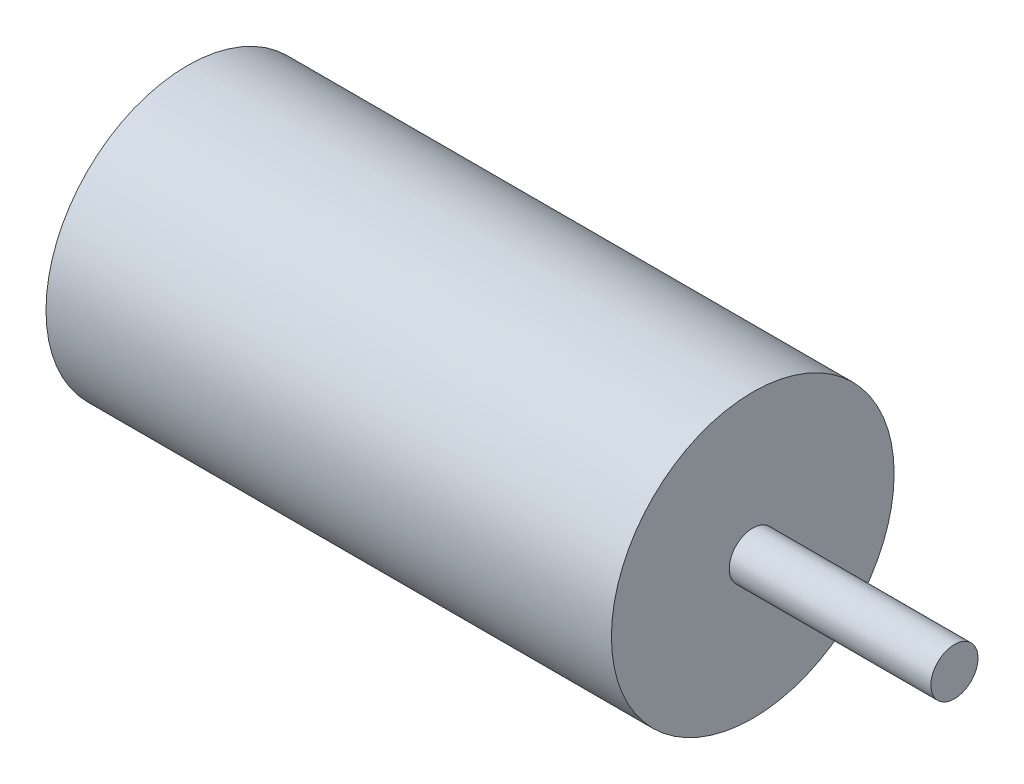
ISO-10303-21;
HEADER;
FILE_DESCRIPTION(('STEP AP214'),'2;1');
FILE_NAME('part.step','',(''),(''),'','','');
FILE_SCHEMA(('AUTOMOTIVE_DESIGN { 1 0 10303 214 1 1 1 1 }'));
ENDSEC;
DATA;
#1=APPLICATION_CONTEXT('core data for automotive mechanical design processes');
#2=APPLICATION_PROTOCOL_DEFINITION('international standard','automotive_design',2000,#1);
#3=PRODUCT_CONTEXT('',#1,'mechanical');
#4=PRODUCT('Part','Part','',(#3));
#5=PRODUCT_RELATED_PRODUCT_CATEGORY('part','',(#4));
#6=PRODUCT_DEFINITION_FORMATION('','',#4);
#7=PRODUCT_DEFINITION_CONTEXT('part definition',#1,'design');
#8=PRODUCT_DEFINITION('design','',#6,#7);
#9=PRODUCT_DEFINITION_SHAPE('','',#8);
#10=(LENGTH_UNIT() NAMED_UNIT(*) SI_UNIT(.MILLI.,.METRE.));
#11=(NAMED_UNIT(*) PLANE_ANGLE_UNIT() SI_UNIT($,.RADIAN.));
#12=(NAMED_UNIT(*) SI_UNIT($,.STERADIAN.) SOLID_ANGLE_UNIT());
#13=UNCERTAINTY_MEASURE_WITH_UNIT(LENGTH_MEASURE(1.E-05),#10,'distance_accuracy_value','');
#14=(GEOMETRIC_REPRESENTATION_CONTEXT(3) GLOBAL_UNCERTAINTY_ASSIGNED_CONTEXT((#13)) GLOBAL_UNIT_ASSIGNED_CONTEXT((#10,
#11,#12)) REPRESENTATION_CONTEXT('',''));
#15=CARTESIAN_POINT('',(0.,0.,0.));
#16=DIRECTION('',(0.,0.,1.));
#17=DIRECTION('',(1.,0.,0.));
#18=AXIS2_PLACEMENT_3D('',#15,#16,#17);
#19=CARTESIAN_POINT('',(76.2,0.,0.));
#20=DIRECTION('',(-1.,0.,0.));
#21=DIRECTION('',(0.,0.,1.));
#22=AXIS2_PLACEMENT_3D('',#19,#20,#21);
#23=CYLINDRICAL_SURFACE('',#22,19.05);
#24=CARTESIAN_POINT('',(76.2,0.,0.));
#25=DIRECTION('',(1.,0.,0.));
#26=DIRECTION('',(0.,0.,-1.));
#27=AXIS2_PLACEMENT_3D('',#24,#25,#26);
#28=CIRCLE('',#27,19.05);
#29=CARTESIAN_POINT('',(76.2,0.,19.05));
#30=VERTEX_POINT('',#29);
#31=EDGE_CURVE('E10',#30,#30,#28,.T.);
#32=CARTESIAN_POINT('',(0.,0.,0.));
#33=DIRECTION('',(1.,0.,0.));
#34=DIRECTION('',(0.,0.,-1.));
#35=AXIS2_PLACEMENT_3D('',#32,#33,#34);
#36=CIRCLE('',#35,19.05);
#37=CARTESIAN_POINT('',(0.,0.,19.05));
#38=VERTEX_POINT('',#37);
#39=EDGE_CURVE('E34',#38,#38,#36,.T.);
#40=CARTESIAN_POINT('',(76.2,0.,19.05));
#41=CARTESIAN_POINT('',(75.40625,0.,19.05));
#42=CARTESIAN_POINT('',(74.6125,0.,19.05));
#43=CARTESIAN_POINT('',(73.025,0.,19.05));
#44=CARTESIAN_POINT('',(72.23125,0.,19.05));
#45=CARTESIAN_POINT('',(70.64375,0.,19.05));
#46=CARTESIAN_POINT('',(69.85,0.,19.05));
#47=CARTESIAN_POINT('',(68.2625,0.,19.05));
#48=CARTESIAN_POINT('',(67.46875,0.,19.05));
#49=CARTESIAN_POINT('',(65.88125,0.,19.05));
#50=CARTESIAN_POINT('',(65.0875,0.,19.05));
#51=CARTESIAN_POINT('',(63.5,0.,19.05));
#52=CARTESIAN_POINT('',(62.70625,0.,19.05));
#53=CARTESIAN_POINT('',(61.11875,0.,19.05));
#54=CARTESIAN_POINT('',(60.325,0.,19.05));
#55=CARTESIAN_POINT('',(58.7375,0.,19.05));
#56=CARTESIAN_POINT('',(57.94375,0.,19.05));
#57=CARTESIAN_POINT('',(56.35625,0.,19.05));
#58=CARTESIAN_POINT('',(55.5625,0.,19.05));
#59=CARTESIAN_POINT('',(53.975,0.,19.05));
#60=CARTESIAN_POINT('',(53.18125,0.,19.05));
#61=CARTESIAN_POINT('',(51.59375,0.,19.05));
#62=CARTESIAN_POINT('',(50.8,0.,19.05));
#63=CARTESIAN_POINT('',(49.2125,0.,19.05));
#64=CARTESIAN_POINT('',(48.41875,0.,19.05));
#65=CARTESIAN_POINT('',(46.83125,0.,19.05));
#66=CARTESIAN_POINT('',(46.0375,0.,19.05));
#67=CARTESIAN_POINT('',(44.45,0.,19.05));
#68=CARTESIAN_POINT('',(43.65625,0.,19.05));
#69=CARTESIAN_POINT('',(42.06875,0.,19.05));
#70=CARTESIAN_POINT('',(41.275,0.,19.05));
#71=CARTESIAN_POINT('',(39.6875,0.,19.05));
#72=CARTESIAN_POINT('',(38.89375,0.,19.05));
#73=CARTESIAN_POINT('',(37.30625,0.,19.05));
#74=CARTESIAN_POINT('',(36.5125,0.,19.05));
#75=CARTESIAN_POINT('',(34.925,0.,19.05));
#76=CARTESIAN_POINT('',(34.13125,0.,19.05));
#77=CARTESIAN_POINT('',(32.54375,0.,19.05));
#78=CARTESIAN_POINT('',(31.75,0.,19.05));
#79=CARTESIAN_POINT('',(30.1625,0.,19.05));
#80=CARTESIAN_POINT('',(29.36875,0.,19.05));
#81=CARTESIAN_POINT('',(27.78125,0.,19.05));
#82=CARTESIAN_POINT('',(26.9875,0.,19.05));
#83=CARTESIAN_POINT('',(25.4,0.,19.05));
#84=CARTESIAN_POINT('',(24.60625,0.,19.05));
#85=CARTESIAN_POINT('',(23.01875,0.,19.05));
#86=CARTESIAN_POINT('',(22.225,0.,19.05));
#87=CARTESIAN_POINT('',(20.6375,0.,19.05));
#88=CARTESIAN_POINT('',(19.84375,0.,19.05));
#89=CARTESIAN_POINT('',(18.25625,0.,19.05));
#90=CARTESIAN_POINT('',(17.4625,0.,19.05));
#91=CARTESIAN_POINT('',(15.875,0.,19.05));
#92=CARTESIAN_POINT('',(15.08125,0.,19.05));
#93=CARTESIAN_POINT('',(13.49375,0.,19.05));
#94=CARTESIAN_POINT('',(12.7,0.,19.05));
#95=CARTESIAN_POINT('',(11.1125,0.,19.05));
#96=CARTESIAN_POINT('',(10.31875,0.,19.05));
#97=CARTESIAN_POINT('',(8.73125,0.,19.05));
#98=CARTESIAN_POINT('',(7.93750000000001,0.,19.05));
#99=CARTESIAN_POINT('',(6.35,0.,19.05));
#100=CARTESIAN_POINT('',(5.55625,0.,19.05));
#101=CARTESIAN_POINT('',(3.96875,0.,19.05));
#102=CARTESIAN_POINT('',(3.175,0.,19.05));
#103=CARTESIAN_POINT('',(1.5875,0.,19.05));
#104=CARTESIAN_POINT('',(0.793750000000001,0.,19.05));
#105=CARTESIAN_POINT('',(0.,0.,19.05));
#106=B_SPLINE_CURVE_WITH_KNOTS('',3,(#40,#41,#42,#43,#44,#45,#46,#47,#48,#49,#50,#51,#52,#53,
#54,#55,#56,#57,#58,#59,#60,#61,#62,#63,#64,#65,#66,#67,#68,#69,#70,#71,#72,#73,#74,#75,#76,#77,
#78,#79,#80,#81,#82,#83,#84,#85,#86,#87,#88,#89,#90,#91,#92,#93,#94,#95,#96,#97,#98,#99,#100,
#101,#102,#103,#104,#105),.UNSPECIFIED.,.F.,.F.,(4,2,2,2,2,2,2,2,2,2,2,2,2,2,2,2,2,2,2,2,2,2,2,
2,2,2,2,2,2,2,2,2,4),(0.,2.38125,4.7625,7.14375,9.52500000000001,11.90625,14.2875,16.66875,
19.05,21.43125,23.8125,26.19375,28.575,30.95625,33.3375,35.71875,38.1,40.48125,42.8625,45.24375,
47.625,50.00625,52.3875,54.76875,57.15,59.53125,61.9125,64.29375,66.675,69.05625,71.4375,
73.81875,76.2),.UNSPECIFIED.);
#107=EDGE_CURVE('BSEAM31',#30,#38,#106,.T.);
#108=ORIENTED_EDGE('',*,*,#31,.F.);
#109=ORIENTED_EDGE('',*,*,#39,.T.);
#110=ORIENTED_EDGE('',*,*,#107,.T.);
#111=ORIENTED_EDGE('',*,*,#107,.F.);
#112=EDGE_LOOP('',(#108,#110,#109,#111));
#113=FACE_BOUND('',#112,.T.);
#114=ADVANCED_FACE('F31',(#113),#23,.T.);
#115=CARTESIAN_POINT('',(76.2,0.,0.));
#116=DIRECTION('',(1.,0.,0.));
#117=DIRECTION('',(0.,0.,-1.));
#118=AXIS2_PLACEMENT_3D('',#115,#116,#117);
#119=PLANE('',#118);
#120=CARTESIAN_POINT('',(76.2,0.,0.));
#121=DIRECTION('',(1.,0.,0.));
#122=DIRECTION('',(0.,0.,-1.));
#123=AXIS2_PLACEMENT_3D('',#120,#121,#122);
#124=CIRCLE('',#123,3.175);
#125=CARTESIAN_POINT('',(76.2,0.,-3.175));
#126=VERTEX_POINT('',#125);
#127=EDGE_CURVE('E43',#126,#126,#124,.T.);
#128=ORIENTED_EDGE('',*,*,#127,.F.);
#129=EDGE_LOOP('',(#128));
#130=FACE_BOUND('',#129,.T.);
#131=ORIENTED_EDGE('',*,*,#31,.T.);
#132=EDGE_LOOP('',(#131));
#133=FACE_BOUND('',#132,.T.);
#134=ADVANCED_FACE('F58',(#130,#133),#119,.T.);
#135=CARTESIAN_POINT('',(0.,0.,0.));
#136=DIRECTION('',(1.,0.,0.));
#137=DIRECTION('',(0.,0.,-1.));
#138=AXIS2_PLACEMENT_3D('',#135,#136,#137);
#139=PLANE('',#138);
#140=ORIENTED_EDGE('',*,*,#39,.F.);
#141=EDGE_LOOP('',(#140));
#142=FACE_BOUND('',#141,.T.);
#143=ADVANCED_FACE('F54',(#142),#139,.F.);
#144=CARTESIAN_POINT('',(103.378,0.,0.));
#145=DIRECTION('',(-1.,0.,0.));
#146=DIRECTION('',(0.,0.,1.));
#147=AXIS2_PLACEMENT_3D('',#144,#145,#146);
#148=CYLINDRICAL_SURFACE('',#147,3.175);
#149=CARTESIAN_POINT('',(103.378,0.,0.));
#150=DIRECTION('',(1.,0.,0.));
#151=DIRECTION('',(0.,0.,-1.));
#152=AXIS2_PLACEMENT_3D('',#149,#150,#151);
#153=CIRCLE('',#152,3.175);
#154=CARTESIAN_POINT('',(103.378,0.,-3.175));
#155=VERTEX_POINT('',#154);
#156=EDGE_CURVE('E41',#155,#155,#153,.T.);
#157=ORIENTED_EDGE('',*,*,#156,.F.);
#158=EDGE_LOOP('',(#157));
#159=FACE_BOUND('',#158,.T.);
#160=ORIENTED_EDGE('',*,*,#127,.T.);
#161=EDGE_LOOP('',(#160));
#162=FACE_BOUND('',#161,.T.);
#163=ADVANCED_FACE('F51',(#159,#162),#148,.T.);
#164=CARTESIAN_POINT('',(103.378,0.,0.));
#165=DIRECTION('',(1.,0.,0.));
#166=DIRECTION('',(0.,0.,-1.));
#167=AXIS2_PLACEMENT_3D('',#164,#165,#166);
#168=PLANE('',#167);
#169=ORIENTED_EDGE('',*,*,#156,.T.);
#170=EDGE_LOOP('',(#169));
#171=FACE_BOUND('',#170,.T.);
#172=ADVANCED_FACE('F49',(#171),#168,.T.);
#173=CLOSED_SHELL('',(#114,#134,#143,#163,#172));
#174=MANIFOLD_SOLID_BREP('B2',#173);
#175=ADVANCED_BREP_SHAPE_REPRESENTATION('',(#18,#174),#14);
#176=SHAPE_DEFINITION_REPRESENTATION(#9,#175);
ENDSEC;
END-ISO-10303-21;
